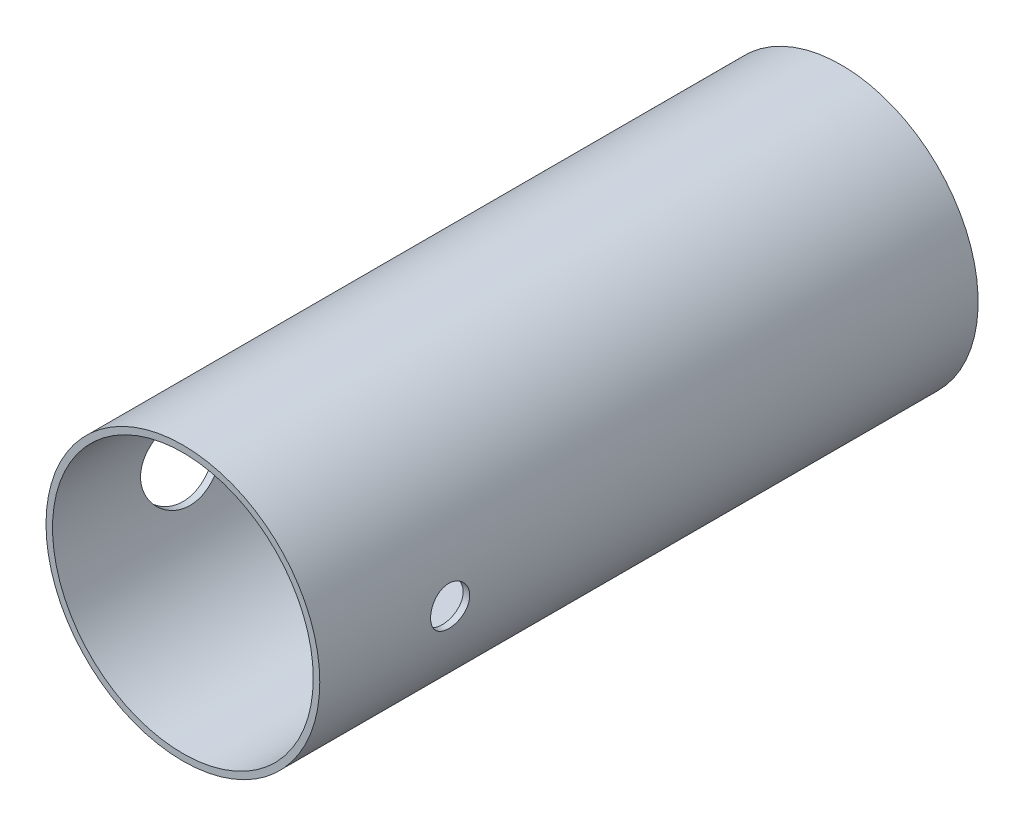
ISO-10303-21;
HEADER;
FILE_DESCRIPTION(('STEP AP214'),'2;1');
FILE_NAME('part.step','',(''),(''),'','','');
FILE_SCHEMA(('AUTOMOTIVE_DESIGN { 1 0 10303 214 1 1 1 1 }'));
ENDSEC;
DATA;
#1=APPLICATION_CONTEXT('core data for automotive mechanical design processes');
#2=APPLICATION_PROTOCOL_DEFINITION('international standard','automotive_design',2000,#1);
#3=PRODUCT_CONTEXT('',#1,'mechanical');
#4=PRODUCT('Part','Part','',(#3));
#5=PRODUCT_RELATED_PRODUCT_CATEGORY('part','',(#4));
#6=PRODUCT_DEFINITION_FORMATION('','',#4);
#7=PRODUCT_DEFINITION_CONTEXT('part definition',#1,'design');
#8=PRODUCT_DEFINITION('design','',#6,#7);
#9=PRODUCT_DEFINITION_SHAPE('','',#8);
#10=(LENGTH_UNIT() NAMED_UNIT(*) SI_UNIT(.MILLI.,.METRE.));
#11=(NAMED_UNIT(*) PLANE_ANGLE_UNIT() SI_UNIT($,.RADIAN.));
#12=(NAMED_UNIT(*) SI_UNIT($,.STERADIAN.) SOLID_ANGLE_UNIT());
#13=UNCERTAINTY_MEASURE_WITH_UNIT(LENGTH_MEASURE(1.E-05),#10,'distance_accuracy_value','');
#14=(GEOMETRIC_REPRESENTATION_CONTEXT(3) GLOBAL_UNCERTAINTY_ASSIGNED_CONTEXT((#13)) GLOBAL_UNIT_ASSIGNED_CONTEXT((#10,
#11,#12)) REPRESENTATION_CONTEXT('',''));
#15=CARTESIAN_POINT('',(0.,0.,0.));
#16=DIRECTION('',(0.,0.,1.));
#17=DIRECTION('',(1.,0.,0.));
#18=AXIS2_PLACEMENT_3D('',#15,#16,#17);
#19=CARTESIAN_POINT('',(0.,0.,100.));
#20=DIRECTION('',(0.,0.,1.));
#21=DIRECTION('',(1.,0.,0.));
#22=AXIS2_PLACEMENT_3D('',#19,#20,#21);
#23=PLANE('',#22);
#24=CARTESIAN_POINT('',(0.,0.,100.));
#25=DIRECTION('',(0.,0.,1.));
#26=DIRECTION('',(1.,0.,0.));
#27=AXIS2_PLACEMENT_3D('',#24,#25,#26);
#28=CIRCLE('',#27,21.);
#29=CARTESIAN_POINT('',(21.,0.,100.));
#30=VERTEX_POINT('',#29);
#31=EDGE_CURVE('E10',#30,#30,#28,.T.);
#32=ORIENTED_EDGE('',*,*,#31,.T.);
#33=EDGE_LOOP('',(#32));
#34=FACE_BOUND('',#33,.T.);
#35=CARTESIAN_POINT('',(0.,0.,100.));
#36=DIRECTION('',(0.,0.,1.));
#37=DIRECTION('',(1.,0.,0.));
#38=AXIS2_PLACEMENT_3D('',#35,#36,#37);
#39=CIRCLE('',#38,20.);
#40=CARTESIAN_POINT('',(20.,0.,100.));
#41=VERTEX_POINT('',#40);
#42=EDGE_CURVE('E39',#41,#41,#39,.T.);
#43=ORIENTED_EDGE('',*,*,#42,.F.);
#44=EDGE_LOOP('',(#43));
#45=FACE_BOUND('',#44,.T.);
#46=ADVANCED_FACE('F32',(#34,#45),#23,.T.);
#47=CARTESIAN_POINT('',(0.,0.,100.));
#48=DIRECTION('',(0.,0.,-1.));
#49=DIRECTION('',(-1.,0.,0.));
#50=AXIS2_PLACEMENT_3D('',#47,#48,#49);
#51=CYLINDRICAL_SURFACE('',#50,21.);
#52=CARTESIAN_POINT('',(21.,0.,83.));
#53=CARTESIAN_POINT('',(20.9999974056865,-0.167596094119236,82.9999930202336));
#54=CARTESIAN_POINT('',(20.9979726060089,-0.335291716486555,82.9859083785218));
#55=CARTESIAN_POINT('',(20.9900901151763,-0.666001981104248,82.929952591298));
#56=CARTESIAN_POINT('',(20.9842286098892,-0.829011796600441,82.8880537946889));
#57=CARTESIAN_POINT('',(20.9693319048547,-1.14551603035633,82.7777418147973));
#58=CARTESIAN_POINT('',(20.9602990250489,-1.29901730804932,82.7093480095205));
#59=CARTESIAN_POINT('',(20.9400596724176,-1.59233895072096,82.5480333713139));
#60=CARTESIAN_POINT('',(20.9288535229507,-1.73216134631596,82.4551161864513));
#61=CARTESIAN_POINT('',(20.9054261736267,-1.99517595119195,82.2466874864982));
#62=CARTESIAN_POINT('',(20.8931989730243,-2.11825677240196,82.1310360714263));
#63=CARTESIAN_POINT('',(20.8691549946365,-2.34333387530589,81.880722756381));
#64=CARTESIAN_POINT('',(20.8573382396341,-2.4453289881261,81.7460598032104));
#65=CARTESIAN_POINT('',(20.8353946947205,-2.62576762926669,81.4608046518387));
#66=CARTESIAN_POINT('',(20.8252756559889,-2.70410437642166,81.3101442611446));
#67=CARTESIAN_POINT('',(20.8079544796886,-2.8343203550043,80.9976363815268));
#68=CARTESIAN_POINT('',(20.8007521980065,-2.88620089363496,80.83578944578));
#69=CARTESIAN_POINT('',(20.7901385812978,-2.96168796018351,80.5066699705159));
#70=CARTESIAN_POINT('',(20.7867017857081,-2.98548446558387,80.3394418402165));
#71=CARTESIAN_POINT('',(20.7839308153626,-3.00471630022706,80.0033332836956));
#72=CARTESIAN_POINT('',(20.7845964266112,-3.00015310880938,79.8344529441178));
#73=CARTESIAN_POINT('',(20.7899317731309,-2.96295054293824,79.5011703640008));
#74=CARTESIAN_POINT('',(20.7945714330636,-2.93052204538949,79.3367440338624));
#75=CARTESIAN_POINT('',(20.8072851506852,-2.83883916964287,79.0156907411472));
#76=CARTESIAN_POINT('',(20.8153592972262,-2.77958409742445,78.8590639804665));
#77=CARTESIAN_POINT('',(20.8340657320583,-2.63570856374862,78.5574101806747));
#78=CARTESIAN_POINT('',(20.8447070724377,-2.55099807934903,78.4124266628426));
#79=CARTESIAN_POINT('',(20.8673422167019,-2.35868053716115,78.1386523634321));
#80=CARTESIAN_POINT('',(20.8793361011855,-2.25107211453767,78.0098625478102));
#81=CARTESIAN_POINT('',(20.9034580704135,-2.01485237614319,77.7709087906561));
#82=CARTESIAN_POINT('',(20.915586386536,-1.88605961273285,77.6609241648201));
#83=CARTESIAN_POINT('',(20.9385095368678,-1.61174747820268,77.4641044963302));
#84=CARTESIAN_POINT('',(20.9493043661767,-1.46622804561748,77.3772695387481));
#85=CARTESIAN_POINT('',(20.9683540594041,-1.16244311944154,77.2292076875021));
#86=CARTESIAN_POINT('',(20.9766076291806,-1.00417118320097,77.1679938357586));
#87=CARTESIAN_POINT('',(20.9896337983806,-0.679450048131295,77.0730635920408));
#88=CARTESIAN_POINT('',(20.9944066110647,-0.513001350946924,77.0393455154273));
#89=CARTESIAN_POINT('',(20.999905418591,-0.178200033584919,77.0006005597693));
#90=CARTESIAN_POINT('',(21.0006662043672,-0.00987650931358856,76.9953270102972));
#91=CARTESIAN_POINT('',(20.9981497090155,0.325252275469941,77.0129672120301));
#92=CARTESIAN_POINT('',(20.9948725409597,0.492057578364085,77.0358801739476));
#93=CARTESIAN_POINT('',(20.9846699059845,0.818673626976727,77.1090379123921));
#94=CARTESIAN_POINT('',(20.9777603809513,0.978511657380177,77.1591632887693));
#95=CARTESIAN_POINT('',(20.9610656140865,1.28751441603702,77.2851976089431));
#96=CARTESIAN_POINT('',(20.9512802482295,1.43667868362162,77.3611076647687));
#97=CARTESIAN_POINT('',(20.929835657564,1.72118954369679,77.5371407254812));
#98=CARTESIAN_POINT('',(20.9181644227381,1.85643781904695,77.6374211445582));
#99=CARTESIAN_POINT('',(20.8942866964616,2.10827294220729,77.8591281140784));
#100=CARTESIAN_POINT('',(20.8820801769622,2.22485881061787,77.980555773627));
#101=CARTESIAN_POINT('',(20.8583982025456,2.4369504693115,78.2422050514467));
#102=CARTESIAN_POINT('',(20.8469289232276,2.53229145127256,78.3825609054508));
#103=CARTESIAN_POINT('',(20.8261270722122,2.69804353130872,78.677439779906));
#104=CARTESIAN_POINT('',(20.8167944471037,2.76845525257625,78.8319624460874));
#105=CARTESIAN_POINT('',(20.8013665539264,2.882091161378,79.1502849567594));
#106=CARTESIAN_POINT('',(20.7952607456885,2.92540395197956,79.314052638262));
#107=CARTESIAN_POINT('',(20.7869491389665,2.9838955980023,79.6466308415834));
#108=CARTESIAN_POINT('',(20.7847430982431,2.99907620089529,79.8154410495165));
#109=CARTESIAN_POINT('',(20.7844892661761,3.00083385561316,80.1516707397819));
#110=CARTESIAN_POINT('',(20.7864038148477,2.98766996051709,80.319088897483));
#111=CARTESIAN_POINT('',(20.7940938631797,2.933665437762,80.6493051860877));
#112=CARTESIAN_POINT('',(20.799869358862,2.89282483862027,80.8121033217515));
#113=CARTESIAN_POINT('',(20.8146178421627,2.78471468348695,81.1283978976668));
#114=CARTESIAN_POINT('',(20.8235888432653,2.71746154443902,81.2819000476446));
#115=CARTESIAN_POINT('',(20.8437201859108,2.55846096304632,81.5754836674301));
#116=CARTESIAN_POINT('',(20.8548805875894,2.4667128478776,81.7155647684471));
#117=CARTESIAN_POINT('',(20.8782549397934,2.26037921194643,81.9796487277934));
#118=CARTESIAN_POINT('',(20.8904772339548,2.14560139410548,82.1035006178034));
#119=CARTESIAN_POINT('',(20.914527330811,1.89687226998173,82.3302795611483));
#120=CARTESIAN_POINT('',(20.9263550408,1.76291649650242,82.4332017256827));
#121=CARTESIAN_POINT('',(20.9483499373884,1.47885513680077,82.6156513580542));
#122=CARTESIAN_POINT('',(20.958508576793,1.32867257618145,82.6950599812368));
#123=CARTESIAN_POINT('',(20.9759363411233,1.01703193255506,82.8274096160091));
#124=CARTESIAN_POINT('',(20.9832085020462,0.855585907798471,82.8803784521486));
#125=CARTESIAN_POINT('',(20.9923554450757,0.577817045996335,82.9461253803689));
#126=CARTESIAN_POINT('',(20.9952076628469,0.46322084876786,82.9662980554074));
#127=CARTESIAN_POINT('',(20.9990308298669,0.232432382048494,82.9932377136323));
#128=CARTESIAN_POINT('',(21.0000017993459,0.116240129734591,83.0000048409777));
#129=CARTESIAN_POINT('',(21.,0.,83.));
#130=B_SPLINE_CURVE_WITH_KNOTS('',3,(#52,#53,#54,#55,#56,#57,#58,#59,#60,#61,#62,#63,#64,#65,
#66,#67,#68,#69,#70,#71,#72,#73,#74,#75,#76,#77,#78,#79,#80,#81,#82,#83,#84,#85,#86,#87,#88,#89,
#90,#91,#92,#93,#94,#95,#96,#97,#98,#99,#100,#101,#102,#103,#104,#105,#106,#107,#108,#109,#110,
#111,#112,#113,#114,#115,#116,#117,#118,#119,#120,#121,#122,#123,#124,#125,#126,#127,#128,#129),
.UNSPECIFIED.,.T.,.F.,(4,2,2,2,2,2,2,2,2,2,2,2,2,2,2,2,2,2,2,2,2,2,2,2,2,2,2,2,2,2,2,2,2,2,2,2,
2,2,4),(0.,0.502363580029316,1.00522732798751,1.50772398209056,2.01014592751552,
2.51576230286422,3.02140669924482,3.52930032127673,4.03716884581975,4.54158177962932,
5.04596840174338,5.54657124869584,6.04718704730239,6.5495945343285,7.05203197582394,
7.55902135060045,8.06601258846691,8.57326158731495,9.08047950517876,9.5832916812913,
10.0860897778209,10.5866993660541,11.0873305470749,11.5912856397995,12.0952671713275,
12.6030318708704,13.1107838761954,13.6168669311128,14.1229185488903,14.6243647777069,
15.1258104898482,15.6269450160763,16.1280933088006,16.6336147126422,17.1392540617367,
17.6474070749897,18.1550241876921,18.5034537617364,18.8518795888622),.UNSPECIFIED.);
#131=CARTESIAN_POINT('',(21.,0.,83.));
#132=VERTEX_POINT('',#131);
#133=EDGE_CURVE('E84',#132,#132,#130,.T.);
#134=ORIENTED_EDGE('',*,*,#133,.F.);
#135=EDGE_LOOP('',(#134));
#136=FACE_BOUND('',#135,.T.);
#137=CARTESIAN_POINT('',(-21.,0.,86.5));
#138=CARTESIAN_POINT('',(-20.9999998406425,0.178031508561806,86.4999997582303));
#139=CARTESIAN_POINT('',(-20.9977307214615,0.356067186692039,86.4926797349107));
#140=CARTESIAN_POINT('',(-20.9887163553395,0.710826372780009,86.4634669967724));
#141=CARTESIAN_POINT('',(-20.9819709751963,0.887549841531529,86.4415738482951));
#142=CARTESIAN_POINT('',(-20.9641890050127,1.23840004768752,86.3834149263409));
#143=CARTESIAN_POINT('',(-20.9531522811359,1.41252670392799,86.347148704603));
#144=CARTESIAN_POINT('',(-20.9270827835593,1.7570017991689,86.2605508901979));
#145=CARTESIAN_POINT('',(-20.9120486177555,1.92734889950977,86.2102143972632));
#146=CARTESIAN_POINT('',(-20.8784185459774,2.26274111293549,86.0960094663058));
#147=CARTESIAN_POINT('',(-20.8598289425013,2.42779501328206,86.0321649521318));
#148=CARTESIAN_POINT('',(-20.8195590900537,2.75183945577388,85.8913993961286));
#149=CARTESIAN_POINT('',(-20.7978787412999,2.9108298019515,85.814477932104));
#150=CARTESIAN_POINT('',(-20.7519833393623,3.22178473757378,85.6481150953337));
#151=CARTESIAN_POINT('',(-20.7277676506188,3.37374755152423,85.5586705814015));
#152=CARTESIAN_POINT('',(-20.6774333341085,3.66964164789838,85.3679331263963));
#153=CARTESIAN_POINT('',(-20.6513152815004,3.81357533479109,85.2666437609219));
#154=CARTESIAN_POINT('',(-20.5970902511633,4.09648513324685,85.0498947607618));
#155=CARTESIAN_POINT('',(-20.5689482153341,4.2352133618539,84.9341202490324));
#156=CARTESIAN_POINT('',(-20.5121091819331,4.50244783107462,84.6915369690688));
#157=CARTESIAN_POINT('',(-20.4834123737791,4.63095748661665,84.5647319170295));
#158=CARTESIAN_POINT('',(-20.4262110124313,4.87707671661285,84.3007791003328));
#159=CARTESIAN_POINT('',(-20.3977065706631,4.99468040514458,84.1636258223471));
#160=CARTESIAN_POINT('',(-20.3416951409651,5.21811295313139,83.8799338265412));
#161=CARTESIAN_POINT('',(-20.31418779177,5.32394610660704,83.7333985623161));
#162=CARTESIAN_POINT('',(-20.260271238907,5.52562904814409,83.428077449523));
#163=CARTESIAN_POINT('',(-20.2339057826041,5.62116866267023,83.2690787359607));
#164=CARTESIAN_POINT('',(-20.183823547647,5.79842659232622,82.9432351822199));
#165=CARTESIAN_POINT('',(-20.1601057314866,5.88015032785995,82.7763934520916));
#166=CARTESIAN_POINT('',(-20.1160422808168,6.02916960626318,82.4359091779875));
#167=CARTESIAN_POINT('',(-20.0956973492443,6.09646214240801,82.2622652256717));
#168=CARTESIAN_POINT('',(-20.0590517821186,6.21597556101185,81.9095302881095));
#169=CARTESIAN_POINT('',(-20.0427493578216,6.26820311115891,81.7304417515251));
#170=CARTESIAN_POINT('',(-20.0151307827279,6.35583112606298,81.373392847992));
#171=CARTESIAN_POINT('',(-20.0036828848259,6.39167857439965,81.1955523476303));
#172=CARTESIAN_POINT('',(-19.9854733215997,6.448390969933,80.8373308521693));
#173=CARTESIAN_POINT('',(-19.9787097491925,6.4692620144495,80.6569509214766));
#174=CARTESIAN_POINT('',(-19.9700842877282,6.49583941190395,80.2949655687537));
#175=CARTESIAN_POINT('',(-19.96822224733,6.50154623305666,80.1133601847345));
#176=CARTESIAN_POINT('',(-19.9694614714984,6.49773910031235,79.7503283273178));
#177=CARTESIAN_POINT('',(-19.9725626202907,6.48822550145572,79.568901849846));
#178=CARTESIAN_POINT('',(-19.9834087641117,6.45473983324419,79.2146697938343));
#179=CARTESIAN_POINT('',(-19.9909682652934,6.43134507837965,79.0418035737946));
#180=CARTESIAN_POINT('',(-20.0103492199696,6.37078753490569,78.6986830814716));
#181=CARTESIAN_POINT('',(-20.0221721172183,6.33362008219924,78.5284297143897));
#182=CARTESIAN_POINT('',(-20.0497242274916,6.24585221758369,78.1918025102007));
#183=CARTESIAN_POINT('',(-20.0654523058833,6.19525570713292,78.0254275615686));
#184=CARTESIAN_POINT('',(-20.10036804478,6.08101716211328,77.6975262094047));
#185=CARTESIAN_POINT('',(-20.1195570134232,6.01737019351658,77.5360016662385));
#186=CARTESIAN_POINT('',(-20.1611417572932,5.87654873577318,77.2166467720547));
#187=CARTESIAN_POINT('',(-20.1835786935733,5.7991972182315,77.0588998810483));
#188=CARTESIAN_POINT('',(-20.2308338239116,5.63213082657615,76.750402328173));
#189=CARTESIAN_POINT('',(-20.2556528327739,5.54241171743289,76.5996540865885));
#190=CARTESIAN_POINT('',(-20.3069952738583,5.35123682641856,76.3060932111679));
#191=CARTESIAN_POINT('',(-20.3335187774725,5.24978055279802,76.1632809101935));
#192=CARTESIAN_POINT('',(-20.3875720172036,5.03578041849849,75.8864212648271));
#193=CARTESIAN_POINT('',(-20.4151017837674,4.9232362221532,75.7523741859905));
#194=CARTESIAN_POINT('',(-20.471701117722,4.682458832263,75.4880205833445));
#195=CARTESIAN_POINT('',(-20.500784384912,4.55374847161141,75.3581511826192));
#196=CARTESIAN_POINT('',(-20.5584627224561,4.28583449262792,75.1097046188747));
#197=CARTESIAN_POINT('',(-20.5870579464037,4.14663425317404,74.9911238473121));
#198=CARTESIAN_POINT('',(-20.6429991406959,3.85851362816108,74.7659465227537));
#199=CARTESIAN_POINT('',(-20.6703445424468,3.70958889191461,74.65935539273));
#200=CARTESIAN_POINT('',(-20.7230112101825,3.40308286656676,74.4590132745231));
#201=CARTESIAN_POINT('',(-20.7483332704779,3.24550501584816,74.3652572372086));
#202=CARTESIAN_POINT('',(-20.7964565454733,2.92137756407059,74.1905494163938));
#203=CARTESIAN_POINT('',(-20.8192360662432,2.75476648021629,74.1097056104474));
#204=CARTESIAN_POINT('',(-20.8613834139678,2.41494915550885,73.9624261704655));
#205=CARTESIAN_POINT('',(-20.8807525453142,2.24174546712948,73.895985025502));
#206=CARTESIAN_POINT('',(-20.9155295933871,1.88993692886767,73.7780585985748));
#207=CARTESIAN_POINT('',(-20.930937688585,1.71133232273834,73.7265726427655));
#208=CARTESIAN_POINT('',(-20.9573407327233,1.3500612977524,73.6390350449504));
#209=CARTESIAN_POINT('',(-20.9683358542111,1.16739503800133,73.6029827994826));
#210=CARTESIAN_POINT('',(-20.9852588927557,0.806417621619395,73.5477326531059));
#211=CARTESIAN_POINT('',(-20.9913634134568,0.628204576469489,73.5279465905992));
#212=CARTESIAN_POINT('',(-20.9990170047395,0.270657112226278,73.5031657290822));
#213=CARTESIAN_POINT('',(-21.0005661943058,0.0913227225450072,73.4981705437355));
#214=CARTESIAN_POINT('',(-20.9990659665778,-0.267101989600641,73.5030179086819));
#215=CARTESIAN_POINT('',(-20.9960171399593,-0.446192340456989,73.5128585531168));
#216=CARTESIAN_POINT('',(-20.9854071233732,-0.802813993431311,73.5472812011959));
#217=CARTESIAN_POINT('',(-20.9778459688403,-0.980345307781058,73.5718630890794));
#218=CARTESIAN_POINT('',(-20.9586601839471,-1.32821920720633,73.6347578022092));
#219=CARTESIAN_POINT('',(-20.9471397836251,-1.4986313063865,73.6727190051063));
#220=CARTESIAN_POINT('',(-20.9203023397008,-1.83562873960931,73.7621423188096));
#221=CARTESIAN_POINT('',(-20.9049840257364,-2.00221277279051,73.8136089473754));
#222=CARTESIAN_POINT('',(-20.8709521085124,-2.33035691770258,73.9296035502001));
#223=CARTESIAN_POINT('',(-20.8522394190842,-2.49191836793011,73.9941280095777));
#224=CARTESIAN_POINT('',(-20.8118832777386,-2.80910793941047,74.1357784737555));
#225=CARTESIAN_POINT('',(-20.7902387208417,-2.96473379514377,74.212909231967));
#226=CARTESIAN_POINT('',(-20.7440230848215,-3.27266226822237,74.3811753176386));
#227=CARTESIAN_POINT('',(-20.7193947599426,-3.42479845946737,74.4725994732819));
#228=CARTESIAN_POINT('',(-20.6682682766476,-3.72092392364238,74.6674441903184));
#229=CARTESIAN_POINT('',(-20.6417694735874,-3.86491035671946,74.7708688955809));
#230=CARTESIAN_POINT('',(-20.5875893518191,-4.14383304366838,74.9890124943975));
#231=CARTESIAN_POINT('',(-20.5599079575169,-4.27876871757351,75.1037321105618));
#232=CARTESIAN_POINT('',(-20.5040758332714,-4.53878396057815,75.343741272459));
#233=CARTESIAN_POINT('',(-20.4759250934292,-4.66386332148149,75.4690310413509));
#234=CARTESIAN_POINT('',(-20.4187881248495,-4.90809855051273,75.7345154963978));
#235=CARTESIAN_POINT('',(-20.3898122122445,-5.02683220159503,75.8751012206035));
#236=CARTESIAN_POINT('',(-20.3329738029644,-5.25201496918115,76.1659226616233));
#237=CARTESIAN_POINT('',(-20.3051109347996,-5.35846820717133,76.3161551143499));
#238=CARTESIAN_POINT('',(-20.2512870704667,-5.5584260794601,76.6254159429918));
#239=CARTESIAN_POINT('',(-20.2253268185471,-5.65192565925991,76.7844477187092));
#240=CARTESIAN_POINT('',(-20.1761083876367,-5.82518344022735,77.1101475669856));
#241=CARTESIAN_POINT('',(-20.1528490951112,-5.90494731086415,77.2768124528138));
#242=CARTESIAN_POINT('',(-20.1098200499216,-6.04986232212427,77.6160819958054));
#243=CARTESIAN_POINT('',(-20.0900377574805,-6.11506621343359,77.7886625089339));
#244=CARTESIAN_POINT('',(-20.0544950166299,-6.23064107094697,78.1390516887683));
#245=CARTESIAN_POINT('',(-20.038732948994,-6.28101801026699,78.3168582183074));
#246=CARTESIAN_POINT('',(-20.0117394289934,-6.36649804227454,78.6764263476556));
#247=CARTESIAN_POINT('',(-20.000507483358,-6.40160279793475,78.8581875145838));
#248=CARTESIAN_POINT('',(-19.98295109311,-6.45619795752314,79.2242724641234));
#249=CARTESIAN_POINT('',(-19.9766264455627,-6.47568900713597,79.4085961404447));
#250=CARTESIAN_POINT('',(-19.9692680983039,-6.49834312367828,79.7700889683667));
#251=CARTESIAN_POINT('',(-19.9680110903541,-6.5021953783673,79.9472107339435));
#252=CARTESIAN_POINT('',(-19.9702126220855,-6.4954308165547,80.3012108826386));
#253=CARTESIAN_POINT('',(-19.9736727716471,-6.48480906033599,80.4780891620336));
#254=CARTESIAN_POINT('',(-19.9852001363842,-6.44919557556949,80.8301631388135));
#255=CARTESIAN_POINT('',(-19.9932654097853,-6.42420990361117,81.005359513743));
#256=CARTESIAN_POINT('',(-20.0137543088085,-6.36009192487229,81.3529506361065));
#257=CARTESIAN_POINT('',(-20.026179568778,-6.3209543130488,81.5253443075524));
#258=CARTESIAN_POINT('',(-20.0547990989044,-6.22954964732475,81.8635872099482));
#259=CARTESIAN_POINT('',(-20.0709360688518,-6.17748132735116,82.0294951034018));
#260=CARTESIAN_POINT('',(-20.1066146068149,-6.06034616394195,82.3563432768697));
#261=CARTESIAN_POINT('',(-20.1261573939391,-5.99527466480519,82.5172817537211));
#262=CARTESIAN_POINT('',(-20.1680926983754,-5.85265382870872,82.8331005143131));
#263=CARTESIAN_POINT('',(-20.1904846247561,-5.77510707832475,82.9879820456229));
#264=CARTESIAN_POINT('',(-20.2375240607165,-5.60804335237135,83.2908622969194));
#265=CARTESIAN_POINT('',(-20.2621724240592,-5.51852183998089,83.4388583794648));
#266=CARTESIAN_POINT('',(-20.3140420503701,-5.32448663473447,83.7325578330219));
#267=CARTESIAN_POINT('',(-20.3413255774362,-5.21953149673955,83.8779586977843));
#268=CARTESIAN_POINT('',(-20.3968789363028,-4.99803636442037,84.1595351285467));
#269=CARTESIAN_POINT('',(-20.4251491329945,-4.88149205407064,84.2957072255937));
#270=CARTESIAN_POINT('',(-20.4819027325101,-4.6375996922149,84.5579300115159));
#271=CARTESIAN_POINT('',(-20.510386111852,-4.51025281509507,84.683981797714));
#272=CARTESIAN_POINT('',(-20.5668242052604,-4.24547631302548,84.9252433240029));
#273=CARTESIAN_POINT('',(-20.5947787207621,-4.10804299198783,85.0404490539948));
#274=CARTESIAN_POINT('',(-20.6502785714749,-3.81945785083152,85.2626942790746));
#275=CARTESIAN_POINT('',(-20.6777828390845,-3.66800924733477,85.3693590973253));
#276=CARTESIAN_POINT('',(-20.7306604899878,-3.35629292902972,85.5695247093131));
#277=CARTESIAN_POINT('',(-20.7560338669607,-3.19602518806377,85.6630254640023));
#278=CARTESIAN_POINT('',(-20.8039233918809,-2.86779808771006,85.8361069940199));
#279=CARTESIAN_POINT('',(-20.8264404817312,-2.69984128889806,85.9156923614474));
#280=CARTESIAN_POINT('',(-20.8679796325439,-2.35736459346203,86.0603115073111));
#281=CARTESIAN_POINT('',(-20.8870019891981,-2.18284525360607,86.1253465169654));
#282=CARTESIAN_POINT('',(-20.9194682182151,-1.84447443507129,86.2351136823668));
#283=CARTESIAN_POINT('',(-20.933260133904,-1.68107704155405,86.2811465541101));
#284=CARTESIAN_POINT('',(-20.9571555014009,-1.35093184741897,86.3603297084906));
#285=CARTESIAN_POINT('',(-20.9672592403341,-1.18418430867718,86.3934809939741));
#286=CARTESIAN_POINT('',(-20.983528012278,-0.848412279065829,86.4466339241943));
#287=CARTESIAN_POINT('',(-20.9896929842578,-0.679387752956011,86.4666353651757));
#288=CARTESIAN_POINT('',(-20.9979284385062,-0.340243190389019,86.4933165151953));
#289=CARTESIAN_POINT('',(-21.000000152279,-0.170123498883413,86.5000002310305));
#290=CARTESIAN_POINT('',(-21.,0.,86.5));
#291=B_SPLINE_CURVE_WITH_KNOTS('',3,(#137,#138,#139,#140,#141,#142,#143,#144,#145,#146,#147,
#148,#149,#150,#151,#152,#153,#154,#155,#156,#157,#158,#159,#160,#161,#162,#163,#164,#165,#166,
#167,#168,#169,#170,#171,#172,#173,#174,#175,#176,#177,#178,#179,#180,#181,#182,#183,#184,#185,
#186,#187,#188,#189,#190,#191,#192,#193,#194,#195,#196,#197,#198,#199,#200,#201,#202,#203,#204,
#205,#206,#207,#208,#209,#210,#211,#212,#213,#214,#215,#216,#217,#218,#219,#220,#221,#222,#223,
#224,#225,#226,#227,#228,#229,#230,#231,#232,#233,#234,#235,#236,#237,#238,#239,#240,#241,#242,
#243,#244,#245,#246,#247,#248,#249,#250,#251,#252,#253,#254,#255,#256,#257,#258,#259,#260,#261,
#262,#263,#264,#265,#266,#267,#268,#269,#270,#271,#272,#273,#274,#275,#276,#277,#278,#279,#280,
#281,#282,#283,#284,#285,#286,#287,#288,#289,#290),.UNSPECIFIED.,.T.,.F.,(4,2,2,2,2,2,2,2,2,2,2,
2,2,2,2,2,2,2,2,2,2,2,2,2,2,2,2,2,2,2,2,2,2,2,2,2,2,2,2,2,2,2,2,2,2,2,2,2,2,2,2,2,2,2,2,2,2,2,2,
2,2,2,2,2,2,2,2,2,2,2,2,2,2,2,2,2,4),(0.,0.533937579017771,1.06789104735376,1.60186116970568,
2.13601749057045,2.66923557815642,3.20247088420473,3.73584018335738,4.26904888823957,
4.81703239043489,5.3648319864566,5.91292552856056,6.46081845966687,7.02220891204334,
7.58337859955698,8.14466509281694,8.7057027809367,9.25035149035086,9.794778331785,
10.3391883631502,10.8835856954752,11.4067886386395,11.930168925617,12.453397324388,
12.9768239077297,13.5075837182486,14.038525730226,14.5694899950282,15.1004703387298,
15.6552557345349,16.2098631869203,16.7647204906733,17.3193588908575,17.8784166800818,
18.4372601764867,18.9960784888128,19.5548749492013,20.0924468058692,20.6300046210839,
21.1674933857823,21.7049779297167,22.2292775812493,22.7537528426498,23.2780871141686,
23.8026195525779,24.3395957524523,24.8767579286827,25.413954493093,25.9511624017349,
26.5093541266573,27.067357965869,27.6255789278083,28.1835689266466,28.7395032930184,
29.2952133907768,29.8508629626685,30.4064895552036,30.9373454633496,31.4683825883582,
31.9991959639804,32.5302085286934,33.053516633933,33.5770124429331,34.1003998516668,
34.6239861183169,35.1675334173791,35.7112839072316,36.2549753595704,36.7988670472562,
37.3600014410659,37.9211374992966,38.4820880308326,39.0429910780492,39.5533970105953,
40.0637631994876,40.5741372962633,41.0843578176847),.UNSPECIFIED.);
#292=CARTESIAN_POINT('',(-21.,0.,86.5));
#293=VERTEX_POINT('',#292);
#294=EDGE_CURVE('E57',#293,#293,#291,.T.);
#295=ORIENTED_EDGE('',*,*,#294,.F.);
#296=EDGE_LOOP('',(#295));
#297=FACE_BOUND('',#296,.T.);
#298=ORIENTED_EDGE('',*,*,#31,.F.);
#299=EDGE_LOOP('',(#298));
#300=FACE_BOUND('',#299,.T.);
#301=CARTESIAN_POINT('',(0.,0.,-1.));
#302=DIRECTION('',(0.,0.,-1.));
#303=DIRECTION('',(-1.,0.,0.));
#304=AXIS2_PLACEMENT_3D('',#301,#302,#303);
#305=CIRCLE('',#304,21.);
#306=CARTESIAN_POINT('',(-21.,0.,-1.));
#307=VERTEX_POINT('',#306);
#308=EDGE_CURVE('E93',#307,#307,#305,.T.);
#309=ORIENTED_EDGE('',*,*,#308,.F.);
#310=EDGE_LOOP('',(#309));
#311=FACE_BOUND('',#310,.T.);
#312=ADVANCED_FACE('F34',(#136,#297,#300,#311),#51,.T.);
#313=CARTESIAN_POINT('',(0.,0.,100.));
#314=DIRECTION('',(0.,0.,-1.));
#315=DIRECTION('',(-1.,0.,0.));
#316=AXIS2_PLACEMENT_3D('',#313,#314,#315);
#317=CYLINDRICAL_SURFACE('',#316,20.);
#318=CARTESIAN_POINT('',(20.,0.,83.));
#319=CARTESIAN_POINT('',(19.9999973154259,-0.167503088963288,82.9999930923695));
#320=CARTESIAN_POINT('',(19.9978736507408,-0.335103370164267,82.9859239983187));
#321=CARTESIAN_POINT('',(19.9896063194637,-0.66561925598983,82.9300336000345));
#322=CARTESIAN_POINT('',(19.9834587387695,-0.828530137948464,82.8881852741102));
#323=CARTESIAN_POINT('',(19.9678344243905,-1.14483617244373,82.7780149900648));
#324=CARTESIAN_POINT('',(19.9583602074184,-1.2982384156536,82.7097130409881));
#325=CARTESIAN_POINT('',(19.9371295182345,-1.59138085727051,82.5486232411663));
#326=CARTESIAN_POINT('',(19.9253733630555,-1.73112294945039,82.4558387911653));
#327=CARTESIAN_POINT('',(19.900783419829,-1.99409343912426,82.2476454701203));
#328=CARTESIAN_POINT('',(19.8879426778066,-2.11719966445101,82.1320830875836));
#329=CARTESIAN_POINT('',(19.8626852226648,-2.34234981337898,81.8819446222123));
#330=CARTESIAN_POINT('',(19.8502685339701,-2.44439252545872,81.747367446443));
#331=CARTESIAN_POINT('',(19.8271975491745,-2.62499458999887,81.462198712955));
#332=CARTESIAN_POINT('',(19.8165522395006,-2.70343574074411,81.3115315060373));
#333=CARTESIAN_POINT('',(19.7983242261254,-2.83385264342113,80.9989743587091));
#334=CARTESIAN_POINT('',(19.790741355509,-2.88582983778327,80.8370850305122));
#335=CARTESIAN_POINT('',(19.7795651243735,-2.96146397597823,80.5079639162566));
#336=CARTESIAN_POINT('',(19.775942314825,-2.98533007281036,80.340781213184));
#337=CARTESIAN_POINT('',(19.7730069794116,-3.00471248067866,80.0047476680255));
#338=CARTESIAN_POINT('',(19.7736942060629,-3.00023041947593,79.835896922275));
#339=CARTESIAN_POINT('',(19.7792743670482,-2.96321466501576,79.5027978396117));
#340=CARTESIAN_POINT('',(19.784132375231,-2.93091391855502,79.3385229470304));
#341=CARTESIAN_POINT('',(19.7974521625273,-2.83954234807469,79.0177512622569));
#342=CARTESIAN_POINT('',(19.8059140435876,-2.78047076675625,78.8612546902385));
#343=CARTESIAN_POINT('',(19.8255267109096,-2.63699207059474,78.5597732574343));
#344=CARTESIAN_POINT('',(19.8366879353305,-2.55248628566396,78.4148360618152));
#345=CARTESIAN_POINT('',(19.860434151491,-2.36060826257911,78.1411108084361));
#346=CARTESIAN_POINT('',(19.87301923665,-2.25323452364958,78.0123238114613));
#347=CARTESIAN_POINT('',(19.8983494611242,-2.01738986156497,77.7732046785206));
#348=CARTESIAN_POINT('',(19.9110949422563,-1.88871865928402,77.6630700194273));
#349=CARTESIAN_POINT('',(19.9351929529692,-1.61461417978839,77.4659281309855));
#350=CARTESIAN_POINT('',(19.9465454764502,-1.46918082917636,77.3789210029122));
#351=CARTESIAN_POINT('',(19.9665903117079,-1.16550919642738,77.2304938270009));
#352=CARTESIAN_POINT('',(19.9752810385086,-1.00726335567357,77.1690890163194));
#353=CARTESIAN_POINT('',(19.9890098111414,-0.682546364974126,77.0737812206292));
#354=CARTESIAN_POINT('',(19.9940481039093,-0.516075771905203,77.0398763763688));
#355=CARTESIAN_POINT('',(19.9998716226774,-0.181339135287293,77.0007935403666));
#356=CARTESIAN_POINT('',(20.0006970418078,-0.0131054637409419,76.9953440572413));
#357=CARTESIAN_POINT('',(19.9981112203045,0.321873355324563,77.012606010622));
#358=CARTESIAN_POINT('',(19.9947001108274,0.488618548763752,77.0353165753362));
#359=CARTESIAN_POINT('',(19.9840493723067,0.815064774862812,77.1080282003551));
#360=CARTESIAN_POINT('',(19.9768283041597,0.974795926159671,77.1578969920617));
#361=CARTESIAN_POINT('',(19.9593647131674,1.28362991728599,77.2833699949235));
#362=CARTESIAN_POINT('',(19.9491220484313,1.4327322575902,77.3589754146673));
#363=CARTESIAN_POINT('',(19.9266536493737,1.71726995858384,77.5344124491277));
#364=CARTESIAN_POINT('',(19.9144140325349,1.85259801978313,77.6344162800255));
#365=CARTESIAN_POINT('',(19.8893572602433,2.10464734635541,77.8555716232575));
#366=CARTESIAN_POINT('',(19.8765400712573,2.22136752958681,77.9767243646493));
#367=CARTESIAN_POINT('',(19.8516452860899,2.43387569914391,78.237947066353));
#368=CARTESIAN_POINT('',(19.8395747203518,2.52948169494843,78.3781658503895));
#369=CARTESIAN_POINT('',(19.8176643820981,2.69578258541169,78.6728320810235));
#370=CARTESIAN_POINT('',(19.8078245493126,2.76647815312872,78.8272791430429));
#371=CARTESIAN_POINT('',(19.7915406601729,2.88066934647887,79.1454750672463));
#372=CARTESIAN_POINT('',(19.7850846601288,2.92426074283271,79.3091889219425));
#373=CARTESIAN_POINT('',(19.776267645956,2.98331099003173,79.6417180308702));
#374=CARTESIAN_POINT('',(19.7739063490354,2.99877178366133,79.8105329319894));
#375=CARTESIAN_POINT('',(19.7735566522168,3.0010757333888,80.1466581266316));
#376=CARTESIAN_POINT('',(19.77552452667,2.98820504334626,80.3139664835138));
#377=CARTESIAN_POINT('',(19.7835164122235,2.93482459088758,80.644010526647));
#378=CARTESIAN_POINT('',(19.7895404168223,2.89431487277255,80.8067462202268));
#379=CARTESIAN_POINT('',(19.8049505222459,2.78690747037331,81.1229461644686));
#380=CARTESIAN_POINT('',(19.8143340743215,2.72002978648628,81.2764173408669));
#381=CARTESIAN_POINT('',(19.835409091154,2.56181335284618,81.5700072676048));
#382=CARTESIAN_POINT('',(19.8471006340545,2.47047377483004,81.7101255656073));
#383=CARTESIAN_POINT('',(19.8716148672988,2.26488675318329,81.9744861159503));
#384=CARTESIAN_POINT('',(19.8844473576393,2.15042738079611,82.0985626664941));
#385=CARTESIAN_POINT('',(19.9097157765327,1.90229768216567,82.3258491095756));
#386=CARTESIAN_POINT('',(19.9221516122152,1.76862289670188,82.4290541451523));
#387=CARTESIAN_POINT('',(19.9453037158104,1.48499141508745,82.6121753532147));
#388=CARTESIAN_POINT('',(19.9560101425764,1.33494915352953,82.6919602184295));
#389=CARTESIAN_POINT('',(19.9744005760592,1.02350374049744,82.8250770335161));
#390=CARTESIAN_POINT('',(19.9820877113151,0.862112554193415,82.8784363801074));
#391=CARTESIAN_POINT('',(19.9918187852301,0.583331455778665,82.9450826854202));
#392=CARTESIAN_POINT('',(19.9948709835911,0.467662266990563,82.9656452030776));
#393=CARTESIAN_POINT('',(19.9989625189579,0.234677943200253,82.9931061954253));
#394=CARTESIAN_POINT('',(20.0000018809755,0.117362828668833,83.0000048399051));
#395=CARTESIAN_POINT('',(20.,0.,83.));
#396=B_SPLINE_CURVE_WITH_KNOTS('',3,(#318,#319,#320,#321,#322,#323,#324,#325,#326,#327,#328,
#329,#330,#331,#332,#333,#334,#335,#336,#337,#338,#339,#340,#341,#342,#343,#344,#345,#346,#347,
#348,#349,#350,#351,#352,#353,#354,#355,#356,#357,#358,#359,#360,#361,#362,#363,#364,#365,#366,
#367,#368,#369,#370,#371,#372,#373,#374,#375,#376,#377,#378,#379,#380,#381,#382,#383,#384,#385,
#386,#387,#388,#389,#390,#391,#392,#393,#394,#395),.UNSPECIFIED.,.T.,.F.,(4,2,2,2,2,2,2,2,2,2,2,
2,2,2,2,2,2,2,2,2,2,2,2,2,2,2,2,2,2,2,2,2,2,2,2,2,2,2,4),(0.,0.502080410063327,1.0046499258583,
1.50684004716648,2.0089604483952,2.51458832273687,3.0202452714516,3.52839404790751,
4.03651512451013,4.54083129211849,5.04511850197965,5.54522354391493,6.04534273380725,
6.54742766952318,7.04954556617069,7.55668582510818,8.06382830477337,8.57127217969751,
9.07868174386805,9.58124117088513,10.0837850398231,10.583902979319,11.0840444075255,
11.5878237607382,12.0916324005726,12.5996273316935,13.1076085361767,13.6137844691434,
14.1199254427436,14.6209777652213,15.1220292845913,15.622701479683,16.1233906293376,
16.6288965993145,17.1345200693747,17.6429264676947,18.1508046652289,18.5025970395762,
18.8543850424659),.UNSPECIFIED.);
#397=CARTESIAN_POINT('',(20.,0.,83.));
#398=VERTEX_POINT('',#397);
#399=EDGE_CURVE('E79',#398,#398,#396,.T.);
#400=ORIENTED_EDGE('',*,*,#399,.T.);
#401=EDGE_LOOP('',(#400));
#402=FACE_BOUND('',#401,.T.);
#403=CARTESIAN_POINT('',(-20.,0.,86.5));
#404=CARTESIAN_POINT('',(-20.0000087167979,0.177661219947186,86.5000138880878));
#405=CARTESIAN_POINT('',(-19.997628679536,0.355202063313236,86.4927139638554));
#406=CARTESIAN_POINT('',(-19.9882129442667,0.708973503049883,86.4636562980625));
#407=CARTESIAN_POINT('',(-19.981177216098,0.885204090924696,86.4418984628386));
#408=CARTESIAN_POINT('',(-19.9532921542767,1.41004707555222,86.3550883123696));
#409=CARTESIAN_POINT('',(-19.9256645608417,1.75508916605956,86.2684990619499));
#410=CARTESIAN_POINT('',(-19.8729821924718,2.25680932682776,86.0982108887533));
#411=CARTESIAN_POINT('',(-19.8535553731215,2.42136217827388,86.0347390570439));
#412=CARTESIAN_POINT('',(-19.8114738404897,2.74443471671879,85.8948268399745));
#413=CARTESIAN_POINT('',(-19.7888202070373,2.9029563996069,85.8183907913673));
#414=CARTESIAN_POINT('',(-19.7408487673432,3.21302846209558,85.6530837957786));
#415=CARTESIAN_POINT('',(-19.7155297150543,3.3645755331566,85.5642070264719));
#416=CARTESIAN_POINT('',(-19.6628861239057,3.6596942524478,85.3746975798495));
#417=CARTESIAN_POINT('',(-19.6355622255047,3.8032684221363,85.274068650798));
#418=CARTESIAN_POINT('',(-19.5787402317797,4.08586977413516,85.0584783056209));
#419=CARTESIAN_POINT('',(-19.5492013904741,4.22462854752978,84.9431757357769));
#420=CARTESIAN_POINT('',(-19.4895089706361,4.4919701780009,84.7015589241941));
#421=CARTESIAN_POINT('',(-19.4593555994555,4.62055639823733,84.5752483510946));
#422=CARTESIAN_POINT('',(-19.3992132685488,4.86688928223472,84.3122920549942));
#423=CARTESIAN_POINT('',(-19.3692244099655,4.9846298567952,84.1756406036668));
#424=CARTESIAN_POINT('',(-19.3102543380403,5.20840324345781,83.892945159723));
#425=CARTESIAN_POINT('',(-19.2812727611352,5.31444031047178,83.7469046113552));
#426=CARTESIAN_POINT('',(-19.2243377061035,5.51690175592307,83.4421185242135));
#427=CARTESIAN_POINT('',(-19.1964345856356,5.61298060780506,83.2831337434545));
#428=CARTESIAN_POINT('',(-19.1433896952604,5.79131130845835,82.957228897832));
#429=CARTESIAN_POINT('',(-19.1182468374263,5.87356861167015,82.7903119967633));
#430=CARTESIAN_POINT('',(-19.0714966407636,6.02363665142172,82.4495837014759));
#431=CARTESIAN_POINT('',(-19.0498899703002,6.09144465766847,82.2757710115981));
#432=CARTESIAN_POINT('',(-19.0109342405196,6.21195570143845,81.9226024369654));
#433=CARTESIAN_POINT('',(-18.9935832620719,6.26466554937554,81.7432490920409));
#434=CARTESIAN_POINT('',(-18.9641908090907,6.35307552238214,81.3860712276669));
#435=CARTESIAN_POINT('',(-18.9519977877171,6.3892640681387,81.2083800502228));
#436=CARTESIAN_POINT('',(-18.932544913156,6.44667860668314,80.8504000877334));
#437=CARTESIAN_POINT('',(-18.9252830210323,6.46791078380544,80.6701124078254));
#438=CARTESIAN_POINT('',(-18.9159277069171,6.49522042137851,80.3082685799474));
#439=CARTESIAN_POINT('',(-18.9138340004799,6.50129871586594,80.1267125023389));
#440=CARTESIAN_POINT('',(-18.9148852385187,6.49823976598118,79.7637463679849));
#441=CARTESIAN_POINT('',(-18.9180300445875,6.48910292360966,79.5823363075081));
#442=CARTESIAN_POINT('',(-18.9292027896773,6.45643560941682,79.2289275087156));
#443=CARTESIAN_POINT('',(-18.9370128440833,6.43354712873245,79.0568620565675));
#444=CARTESIAN_POINT('',(-18.9570926635763,6.37413680629754,78.7153066609002));
#445=CARTESIAN_POINT('',(-18.9693639330375,6.33761036555344,78.5458176062821));
#446=CARTESIAN_POINT('',(-18.9979952361082,6.25125923116769,78.210671598582));
#447=CARTESIAN_POINT('',(-19.0143541088593,6.20143831281671,78.0450135720763));
#448=CARTESIAN_POINT('',(-19.0506945467472,6.08888596477173,77.7184867929412));
#449=CARTESIAN_POINT('',(-19.0706774852003,6.02614963964595,77.5576198828707));
#450=CARTESIAN_POINT('',(-19.1140270473255,5.88721851808029,77.2393362051813));
#451=CARTESIAN_POINT('',(-19.1374402770541,5.81083451739197,77.082008419473));
#452=CARTESIAN_POINT('',(-19.1867735306329,5.64580705089031,76.7742660022877));
#453=CARTESIAN_POINT('',(-19.2126944108554,5.55715939251495,76.6238537585489));
#454=CARTESIAN_POINT('',(-19.2663398044793,5.36822050337921,76.3308588711095));
#455=CARTESIAN_POINT('',(-19.2940644247085,5.26792858270252,76.1882766920741));
#456=CARTESIAN_POINT('',(-19.3505927045014,5.05633775288315,75.9117533945624));
#457=CARTESIAN_POINT('',(-19.3793964002305,4.94503847462163,75.7778125661126));
#458=CARTESIAN_POINT('',(-19.4387904220517,4.70630376070964,75.5129011485318));
#459=CARTESIAN_POINT('',(-19.4693983999966,4.57834129633576,75.3824089650069));
#460=CARTESIAN_POINT('',(-19.530141592772,4.31187131966864,75.1326493037602));
#461=CARTESIAN_POINT('',(-19.5602769544722,4.17336716487794,75.0133782789658));
#462=CARTESIAN_POINT('',(-19.6192768206361,3.88656869019758,74.7867475052289));
#463=CARTESIAN_POINT('',(-19.6481407258385,3.73826983446547,74.6793933374488));
#464=CARTESIAN_POINT('',(-19.7037829277521,3.43292983989178,74.4774569708667));
#465=CARTESIAN_POINT('',(-19.7305620460666,3.27589218723247,74.3828697297928));
#466=CARTESIAN_POINT('',(-19.7815511133062,2.95250375088291,74.206298266438));
#467=CARTESIAN_POINT('',(-19.805734302482,2.78607879715586,74.1244420090787));
#468=CARTESIAN_POINT('',(-19.8505404315295,2.44649936558597,73.9751325457032));
#469=CARTESIAN_POINT('',(-19.8711647443321,2.27334751454699,73.9076737830826));
#470=CARTESIAN_POINT('',(-19.9082667052023,1.9215104799587,73.7877268163185));
#471=CARTESIAN_POINT('',(-19.9247446365666,1.74282567537922,73.7352375893665));
#472=CARTESIAN_POINT('',(-19.9530695008734,1.3812645314712,73.6457267747452));
#473=CARTESIAN_POINT('',(-19.9649166353664,1.19838837493365,73.6087045138877));
#474=CARTESIAN_POINT('',(-19.9832386713863,0.837525592242818,73.5517038297348));
#475=CARTESIAN_POINT('',(-19.9899159321165,0.659650576322426,73.5310824368313));
#476=CARTESIAN_POINT('',(-19.9985060841806,0.302692733949477,73.5045859046013));
#477=CARTESIAN_POINT('',(-20.0004191155218,0.123609943145099,73.4987103319368));
#478=CARTESIAN_POINT('',(-19.999427482574,-0.234389585063114,73.5017616815826));
#479=CARTESIAN_POINT('',(-19.9965235019345,-0.413306342425347,73.5106865033623));
#480=CARTESIAN_POINT('',(-19.9859802509709,-0.769653356353053,73.5432482121166));
#481=CARTESIAN_POINT('',(-19.9783410245042,-0.947083626670794,73.5668849628308));
#482=CARTESIAN_POINT('',(-19.9588125014832,-1.29429795757997,73.627794557141));
#483=CARTESIAN_POINT('',(-19.9470458908513,-1.46415809289139,73.6646744310927));
#484=CARTESIAN_POINT('',(-19.9195364440068,-1.80013554313165,73.7518289538449));
#485=CARTESIAN_POINT('',(-19.903792281877,-1.96625158981575,73.802108069591));
#486=CARTESIAN_POINT('',(-19.8687368131312,-2.29355232607353,73.9156254212993));
#487=CARTESIAN_POINT('',(-19.8494264638376,-2.4547383255864,73.9788601798911));
#488=CARTESIAN_POINT('',(-19.8077132598055,-2.77128013462218,74.1178322520779));
#489=CARTESIAN_POINT('',(-19.7853092371731,-2.92663371404186,74.193574289426));
#490=CARTESIAN_POINT('',(-19.7373710854326,-3.23435282949833,74.3590564191824));
#491=CARTESIAN_POINT('',(-19.7117723204737,-3.38654449424784,74.4491010850961));
#492=CARTESIAN_POINT('',(-19.6585592834061,-3.68289603575722,74.6411321622291));
#493=CARTESIAN_POINT('',(-19.6309443171021,-3.82705311572867,74.7431226938848));
#494=CARTESIAN_POINT('',(-19.5744063251992,-4.10645058818912,74.9583570735439));
#495=CARTESIAN_POINT('',(-19.5454831882582,-4.24169021927152,75.0716018804168));
#496=CARTESIAN_POINT('',(-19.4870653764129,-4.50245939910302,75.3086347414341));
#497=CARTESIAN_POINT('',(-19.4575706876181,-4.62798871148837,75.4324230520693));
#498=CARTESIAN_POINT('',(-19.3974898773185,-4.87381624606154,75.6953866559499));
#499=CARTESIAN_POINT('',(-19.3669118091523,-4.99365246445068,75.8349961577829));
#500=CARTESIAN_POINT('',(-19.3068303959735,-5.22112427574327,76.1239631041465));
#501=CARTESIAN_POINT('',(-19.2773266957892,-5.32876392598013,76.2733172807871));
#502=CARTESIAN_POINT('',(-19.2202266840141,-5.53118007870442,76.580941594638));
#503=CARTESIAN_POINT('',(-19.1926311540373,-5.62595132524773,76.7392153378138));
#504=CARTESIAN_POINT('',(-19.1401990660865,-5.80182743162583,77.0635374756467));
#505=CARTESIAN_POINT('',(-19.1153613639592,-5.8829379662186,77.229582605201));
#506=CARTESIAN_POINT('',(-19.0692597479667,-6.03069752216977,77.5679862652852));
#507=CARTESIAN_POINT('',(-19.0479873455174,-6.09738100620747,77.7403285748852));
#508=CARTESIAN_POINT('',(-19.0096354519741,-6.21591859248523,78.0904205331199));
#509=CARTESIAN_POINT('',(-18.9925542513396,-6.26777874241152,78.2681679437175));
#510=CARTESIAN_POINT('',(-18.9631446607588,-6.35620320042352,78.6277895456206));
#511=CARTESIAN_POINT('',(-18.9508155690925,-6.39276976690357,78.8096631234326));
#512=CARTESIAN_POINT('',(-18.9313304960295,-6.45024426813925,79.1761396429026));
#513=CARTESIAN_POINT('',(-18.9241742711106,-6.47115294002031,79.3607424556592));
#514=CARTESIAN_POINT('',(-18.9155022632852,-6.49645596222906,79.7220868444595));
#515=CARTESIAN_POINT('',(-18.9137267830237,-6.50161077047999,79.8987693567042));
#516=CARTESIAN_POINT('',(-18.91513434772,-6.49751479854743,80.2520100946909));
#517=CARTESIAN_POINT('',(-18.9183190807061,-6.48825911427673,80.428568257656));
#518=CARTESIAN_POINT('',(-18.9295462405902,-6.45543010568215,80.7801125858665));
#519=CARTESIAN_POINT('',(-18.9375865741408,-6.43186295129766,80.9550993955793));
#520=CARTESIAN_POINT('',(-18.9582733557829,-6.37062900058205,81.3023770332382));
#521=CARTESIAN_POINT('',(-18.970921533113,-6.33295691078234,81.474666823693));
#522=CARTESIAN_POINT('',(-19.0001729543712,-6.24464159879675,81.8122808815534));
#523=CARTESIAN_POINT('',(-19.0167027620416,-6.19423804277809,81.9776743550113));
#524=CARTESIAN_POINT('',(-19.0533581107597,-6.08055177797949,82.3036262488557));
#525=CARTESIAN_POINT('',(-19.0734849345317,-6.01726447362952,82.4641829204538));
#526=CARTESIAN_POINT('',(-19.1167627495013,-5.87832218330654,82.7793862922816));
#527=CARTESIAN_POINT('',(-19.1399131453971,-5.80266963115318,82.9340341481529));
#528=CARTESIAN_POINT('',(-19.1886251713667,-5.63949583264071,83.2366100244572));
#529=CARTESIAN_POINT('',(-19.2141877163226,-5.55197007744961,83.3845354634338));
#530=CARTESIAN_POINT('',(-19.268147245232,-5.36177867221853,83.6787597169641));
#531=CARTESIAN_POINT('',(-19.2966178158503,-5.25863565058296,83.824736602256));
#532=CARTESIAN_POINT('',(-19.3546733454095,-5.04076683539444,84.1076217127502));
#533=CARTESIAN_POINT('',(-19.3842587165042,-4.9260367311038,84.2445265312726));
#534=CARTESIAN_POINT('',(-19.4437399127276,-4.6857540723595,84.5083859869087));
#535=CARTESIAN_POINT('',(-19.4736357062102,-4.56020261174979,84.6353416272339));
#536=CARTESIAN_POINT('',(-19.532965653471,-4.29897626489291,84.8785928710014));
#537=CARTESIAN_POINT('',(-19.5623996316742,-4.16329763615692,84.9948844978295));
#538=CARTESIAN_POINT('',(-19.6210723665349,-3.87756977130633,85.2200307274516));
#539=CARTESIAN_POINT('',(-19.6502653772275,-3.72717790820551,85.3284629843141));
#540=CARTESIAN_POINT('',(-19.7065009035542,-3.41739681124808,85.5322484140321));
#541=CARTESIAN_POINT('',(-19.733543422688,-3.25800759203406,85.6276016081721));
#542=CARTESIAN_POINT('',(-19.7847077839316,-2.93132368232171,85.8044663754865));
#543=CARTESIAN_POINT('',(-19.8088303469705,-2.76403095741652,85.8859813672829));
#544=CARTESIAN_POINT('',(-19.8534710409744,-2.42266824455715,86.0345115498704));
#545=CARTESIAN_POINT('',(-19.8739893193762,-2.24859853417801,86.1015273337913));
#546=CARTESIAN_POINT('',(-19.909695992903,-1.90573722487565,86.2168178256043));
#547=CARTESIAN_POINT('',(-19.9251335025287,-1.73727329904423,86.2659876448601));
#548=CARTESIAN_POINT('',(-19.9519110921554,-1.39662434856579,86.3506159226465));
#549=CARTESIAN_POINT('',(-19.9632499603994,-1.22443823938073,86.3860703264525));
#550=CARTESIAN_POINT('',(-19.990597429974,-0.704129738039983,86.4712622052408));
#551=CARTESIAN_POINT('',(-19.9999827378154,-0.351828826865818,86.4999724969262));
#552=CARTESIAN_POINT('',(-20.,0.,86.5));
#553=B_SPLINE_CURVE_WITH_KNOTS('',3,(#403,#404,#405,#406,#407,#408,#409,#410,#411,#412,#413,
#414,#415,#416,#417,#418,#419,#420,#421,#422,#423,#424,#425,#426,#427,#428,#429,#430,#431,#432,
#433,#434,#435,#436,#437,#438,#439,#440,#441,#442,#443,#444,#445,#446,#447,#448,#449,#450,#451,
#452,#453,#454,#455,#456,#457,#458,#459,#460,#461,#462,#463,#464,#465,#466,#467,#468,#469,#470,
#471,#472,#473,#474,#475,#476,#477,#478,#479,#480,#481,#482,#483,#484,#485,#486,#487,#488,#489,
#490,#491,#492,#493,#494,#495,#496,#497,#498,#499,#500,#501,#502,#503,#504,#505,#506,#507,#508,
#509,#510,#511,#512,#513,#514,#515,#516,#517,#518,#519,#520,#521,#522,#523,#524,#525,#526,#527,
#528,#529,#530,#531,#532,#533,#534,#535,#536,#537,#538,#539,#540,#541,#542,#543,#544,#545,#546,
#547,#548,#549,#550,#551,#552),.UNSPECIFIED.,.T.,.F.,(4,2,2,2,2,2,2,2,2,2,2,2,2,2,2,2,2,2,2,2,2,
2,2,2,2,2,2,2,2,2,2,2,2,2,2,2,2,2,2,2,2,2,2,2,2,2,2,2,2,2,2,2,2,2,2,2,2,2,2,2,2,2,2,2,2,2,2,2,2,
2,2,2,2,2,4),(0.,0.532581261798452,1.0651659738825,2.12951056476498,2.66136578317743,
3.1930434365397,3.72497075509931,4.25672888033777,4.8045519135505,5.35219306678665,
5.90013983823344,6.44788673807971,7.0107316693616,7.5733539590675,8.13608246599842,
8.69855673854165,9.24311080517136,9.78743957082623,10.3317383771508,10.8760228027295,
11.396681778142,11.9175164890095,12.4382034532857,12.9590881423602,13.4878510674751,
14.0167952089192,14.5457707060288,15.0747639477303,15.6300461657281,16.1851522618823,
16.7405172502186,17.2956622524315,17.8560695553545,18.4162601806253,18.9764125211381,
19.536540478899,20.0734467004921,20.6103371437412,21.1471513958915,21.6839606761963,
22.2060040427007,22.7282216625516,23.2502992993288,23.7725745674401,24.3080071578041,
24.8436249795485,25.3792884753699,25.9149650059447,26.4738411185541,27.0325307651381,
27.5914479197416,28.1501323203935,28.7074670542892,29.2645740787946,29.8215988065669,
30.3785973096828,30.9082467406439,31.4380764579348,31.967677917841,32.497478332454,
33.0179651945301,33.5386380380486,34.0592085220218,34.579977248206,35.1223451300918,
35.6649155374074,36.2074311648156,36.750148280734,37.3125368175246,37.8749244390914,
38.4371729242815,38.9993984048043,39.5272604185325,40.0552783664633,41.1099679639171),.UNSPECIFIED.);
#554=CARTESIAN_POINT('',(-20.,0.,86.5));
#555=VERTEX_POINT('',#554);
#556=EDGE_CURVE('E48',#555,#555,#553,.T.);
#557=ORIENTED_EDGE('',*,*,#556,.T.);
#558=EDGE_LOOP('',(#557));
#559=FACE_BOUND('',#558,.T.);
#560=ORIENTED_EDGE('',*,*,#42,.T.);
#561=EDGE_LOOP('',(#560));
#562=FACE_BOUND('',#561,.T.);
#563=CARTESIAN_POINT('',(0.,0.,0.));
#564=DIRECTION('',(0.,0.,1.));
#565=DIRECTION('',(1.,0.,0.));
#566=AXIS2_PLACEMENT_3D('',#563,#564,#565);
#567=CIRCLE('',#566,20.);
#568=CARTESIAN_POINT('',(20.,0.,0.));
#569=VERTEX_POINT('',#568);
#570=EDGE_CURVE('E43',#569,#569,#567,.T.);
#571=ORIENTED_EDGE('',*,*,#570,.F.);
#572=EDGE_LOOP('',(#571));
#573=FACE_BOUND('',#572,.T.);
#574=ADVANCED_FACE('F124',(#402,#559,#562,#573),#317,.F.);
#575=CARTESIAN_POINT('',(21.001,0.,80.));
#576=DIRECTION('',(-1.,0.,0.));
#577=DIRECTION('',(0.,0.,1.));
#578=AXIS2_PLACEMENT_3D('',#575,#576,#577);
#579=CYLINDRICAL_SURFACE('',#578,6.5);
#580=ORIENTED_EDGE('',*,*,#556,.F.);
#581=EDGE_LOOP('',(#580));
#582=FACE_BOUND('',#581,.T.);
#583=ORIENTED_EDGE('',*,*,#294,.T.);
#584=EDGE_LOOP('',(#583));
#585=FACE_BOUND('',#584,.T.);
#586=ADVANCED_FACE('F63',(#582,#585),#579,.F.);
#587=CARTESIAN_POINT('',(21.001,0.,80.));
#588=DIRECTION('',(-1.,0.,0.));
#589=DIRECTION('',(0.,0.,1.));
#590=AXIS2_PLACEMENT_3D('',#587,#588,#589);
#591=CYLINDRICAL_SURFACE('',#590,3.00000000000001);
#592=ORIENTED_EDGE('',*,*,#399,.F.);
#593=EDGE_LOOP('',(#592));
#594=FACE_BOUND('',#593,.T.);
#595=ORIENTED_EDGE('',*,*,#133,.T.);
#596=EDGE_LOOP('',(#595));
#597=FACE_BOUND('',#596,.T.);
#598=ADVANCED_FACE('F68',(#594,#597),#591,.F.);
#599=CARTESIAN_POINT('',(0.,0.,0.));
#600=DIRECTION('',(0.,0.,-1.));
#601=DIRECTION('',(-1.,0.,0.));
#602=AXIS2_PLACEMENT_3D('',#599,#600,#601);
#603=PLANE('',#602);
#604=CARTESIAN_POINT('',(-2.63227696358173,6.48622524948669,0.));
#605=DIRECTION('',(0.,0.,-1.));
#606=DIRECTION('',(-1.,0.,0.));
#607=AXIS2_PLACEMENT_3D('',#604,#605,#606);
#608=CIRCLE('',#607,6.5);
#609=CARTESIAN_POINT('',(-9.13227696358173,6.48622524948669,0.));
#610=VERTEX_POINT('',#609);
#611=EDGE_CURVE('E97',#610,#610,#608,.F.);
#612=ORIENTED_EDGE('',*,*,#611,.F.);
#613=EDGE_LOOP('',(#612));
#614=FACE_BOUND('',#613,.T.);
#615=ORIENTED_EDGE('',*,*,#570,.T.);
#616=EDGE_LOOP('',(#615));
#617=FACE_BOUND('',#616,.T.);
#618=ADVANCED_FACE('F73',(#614,#617),#603,.F.);
#619=CARTESIAN_POINT('',(0.,0.,-1.));
#620=DIRECTION('',(0.,0.,-1.));
#621=DIRECTION('',(-1.,0.,0.));
#622=AXIS2_PLACEMENT_3D('',#619,#620,#621);
#623=PLANE('',#622);
#624=CARTESIAN_POINT('',(-2.63227696358173,6.48622524948669,-1.));
#625=DIRECTION('',(0.,0.,-1.));
#626=DIRECTION('',(-1.,0.,0.));
#627=AXIS2_PLACEMENT_3D('',#624,#625,#626);
#628=CIRCLE('',#627,6.5);
#629=CARTESIAN_POINT('',(-9.13227696358173,6.48622524948669,-1.));
#630=VERTEX_POINT('',#629);
#631=EDGE_CURVE('E101',#630,#630,#628,.T.);
#632=ORIENTED_EDGE('',*,*,#631,.F.);
#633=EDGE_LOOP('',(#632));
#634=FACE_BOUND('',#633,.T.);
#635=ORIENTED_EDGE('',*,*,#308,.T.);
#636=EDGE_LOOP('',(#635));
#637=FACE_BOUND('',#636,.T.);
#638=ADVANCED_FACE('F110',(#634,#637),#623,.T.);
#639=CARTESIAN_POINT('',(-2.63227696358173,6.48622524948669,100.001));
#640=DIRECTION('',(0.,0.,-1.));
#641=DIRECTION('',(-1.,0.,0.));
#642=AXIS2_PLACEMENT_3D('',#639,#640,#641);
#643=CYLINDRICAL_SURFACE('',#642,6.5);
#644=ORIENTED_EDGE('',*,*,#631,.T.);
#645=EDGE_LOOP('',(#644));
#646=FACE_BOUND('',#645,.T.);
#647=ORIENTED_EDGE('',*,*,#611,.T.);
#648=EDGE_LOOP('',(#647));
#649=FACE_BOUND('',#648,.T.);
#650=ADVANCED_FACE('F107',(#646,#649),#643,.F.);
#651=CLOSED_SHELL('',(#46,#312,#574,#586,#598,#618,#638,#650));
#652=MANIFOLD_SOLID_BREP('B2',#651);
#653=ADVANCED_BREP_SHAPE_REPRESENTATION('',(#18,#652),#14);
#654=SHAPE_DEFINITION_REPRESENTATION(#9,#653);
ENDSEC;
END-ISO-10303-21;
